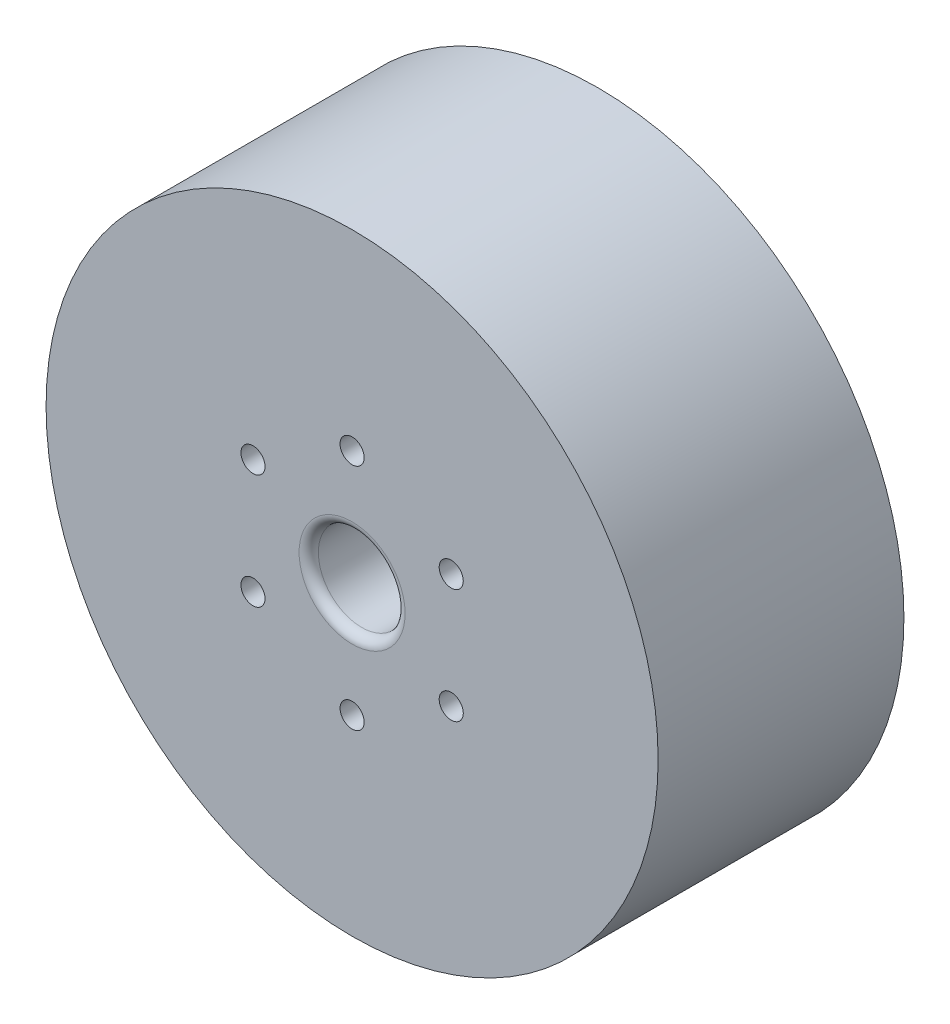
ISO-10303-21;
HEADER;
FILE_DESCRIPTION(('STEP AP214'),'2;1');
FILE_NAME('part.step','',(''),(''),'','','');
FILE_SCHEMA(('AUTOMOTIVE_DESIGN { 1 0 10303 214 1 1 1 1 }'));
ENDSEC;
DATA;
#1=APPLICATION_CONTEXT('core data for automotive mechanical design processes');
#2=APPLICATION_PROTOCOL_DEFINITION('international standard','automotive_design',2000,#1);
#3=PRODUCT_CONTEXT('',#1,'mechanical');
#4=PRODUCT('Part','Part','',(#3));
#5=PRODUCT_RELATED_PRODUCT_CATEGORY('part','',(#4));
#6=PRODUCT_DEFINITION_FORMATION('','',#4);
#7=PRODUCT_DEFINITION_CONTEXT('part definition',#1,'design');
#8=PRODUCT_DEFINITION('design','',#6,#7);
#9=PRODUCT_DEFINITION_SHAPE('','',#8);
#10=(LENGTH_UNIT() NAMED_UNIT(*) SI_UNIT(.MILLI.,.METRE.));
#11=(NAMED_UNIT(*) PLANE_ANGLE_UNIT() SI_UNIT($,.RADIAN.));
#12=(NAMED_UNIT(*) SI_UNIT($,.STERADIAN.) SOLID_ANGLE_UNIT());
#13=UNCERTAINTY_MEASURE_WITH_UNIT(LENGTH_MEASURE(1.E-05),#10,'distance_accuracy_value','');
#14=(GEOMETRIC_REPRESENTATION_CONTEXT(3) GLOBAL_UNCERTAINTY_ASSIGNED_CONTEXT((#13)) GLOBAL_UNIT_ASSIGNED_CONTEXT((#10,
#11,#12)) REPRESENTATION_CONTEXT('',''));
#15=CARTESIAN_POINT('',(0.,0.,0.));
#16=DIRECTION('',(0.,0.,1.));
#17=DIRECTION('',(1.,0.,0.));
#18=AXIS2_PLACEMENT_3D('',#15,#16,#17);
#19=CARTESIAN_POINT('',(0.,0.,25.5));
#20=DIRECTION('',(0.,0.,1.));
#21=DIRECTION('',(1.,0.,0.));
#22=AXIS2_PLACEMENT_3D('',#19,#20,#21);
#23=PLANE('',#22);
#24=CARTESIAN_POINT('',(0.,0.,25.5));
#25=DIRECTION('',(0.,0.,1.));
#26=DIRECTION('',(1.,0.,0.));
#27=AXIS2_PLACEMENT_3D('',#24,#25,#26);
#28=CIRCLE('',#27,11.);
#29=CARTESIAN_POINT('',(11.,0.,25.5));
#30=VERTEX_POINT('',#29);
#31=EDGE_CURVE('E10',#30,#30,#28,.F.);
#32=ORIENTED_EDGE('',*,*,#31,.T.);
#33=EDGE_LOOP('',(#32));
#34=FACE_BOUND('',#33,.T.);
#35=CARTESIAN_POINT('',(-20.5681033398769,-11.8750000000021,25.5));
#36=DIRECTION('',(0.,0.,1.));
#37=DIRECTION('',(1.,0.,0.));
#38=AXIS2_PLACEMENT_3D('',#35,#36,#37);
#39=CIRCLE('',#38,2.5000000000042);
#40=CARTESIAN_POINT('',(-18.0681033398727,-11.8750000000021,25.5));
#41=VERTEX_POINT('',#40);
#42=EDGE_CURVE('E104',#41,#41,#39,.T.);
#43=ORIENTED_EDGE('',*,*,#42,.F.);
#44=EDGE_LOOP('',(#43));
#45=FACE_BOUND('',#44,.T.);
#46=CARTESIAN_POINT('',(20.568103339884,-11.874999999998,25.5));
#47=DIRECTION('',(0.,0.,1.));
#48=DIRECTION('',(1.,0.,0.));
#49=AXIS2_PLACEMENT_3D('',#46,#47,#48);
#50=CIRCLE('',#49,2.50000000000289);
#51=CARTESIAN_POINT('',(23.0681033398869,-11.874999999998,25.5));
#52=VERTEX_POINT('',#51);
#53=EDGE_CURVE('E88',#52,#52,#50,.T.);
#54=ORIENTED_EDGE('',*,*,#53,.F.);
#55=EDGE_LOOP('',(#54));
#56=FACE_BOUND('',#55,.T.);
#57=CARTESIAN_POINT('',(0.,23.75,25.5));
#58=DIRECTION('',(0.,0.,1.));
#59=DIRECTION('',(1.,0.,0.));
#60=AXIS2_PLACEMENT_3D('',#57,#58,#59);
#61=CIRCLE('',#60,2.5);
#62=CARTESIAN_POINT('',(2.5,23.75,25.5));
#63=VERTEX_POINT('',#62);
#64=EDGE_CURVE('E72',#63,#63,#61,.T.);
#65=ORIENTED_EDGE('',*,*,#64,.F.);
#66=EDGE_LOOP('',(#65));
#67=FACE_BOUND('',#66,.T.);
#68=CARTESIAN_POINT('',(0.,0.,25.5));
#69=DIRECTION('',(0.,0.,1.));
#70=DIRECTION('',(1.,0.,0.));
#71=AXIS2_PLACEMENT_3D('',#68,#69,#70);
#72=CIRCLE('',#71,63.5);
#73=CARTESIAN_POINT('',(63.5,0.,25.5));
#74=VERTEX_POINT('',#73);
#75=EDGE_CURVE('E67',#74,#74,#72,.T.);
#76=ORIENTED_EDGE('',*,*,#75,.T.);
#77=EDGE_LOOP('',(#76));
#78=FACE_BOUND('',#77,.T.);
#79=CARTESIAN_POINT('',(20.5681033398816,11.875000000002,25.5));
#80=DIRECTION('',(0.,0.,1.));
#81=DIRECTION('',(1.,0.,0.));
#82=AXIS2_PLACEMENT_3D('',#79,#80,#81);
#83=CIRCLE('',#82,2.50000000000059);
#84=CARTESIAN_POINT('',(23.0681033398822,11.875000000002,25.5));
#85=VERTEX_POINT('',#84);
#86=EDGE_CURVE('E80',#85,#85,#83,.T.);
#87=ORIENTED_EDGE('',*,*,#86,.F.);
#88=EDGE_LOOP('',(#87));
#89=FACE_BOUND('',#88,.T.);
#90=CARTESIAN_POINT('',(4.71638358436074E-12,-23.75,25.5));
#91=DIRECTION('',(0.,0.,1.));
#92=DIRECTION('',(1.,0.,0.));
#93=AXIS2_PLACEMENT_3D('',#90,#91,#92);
#94=CIRCLE('',#93,2.50000000000467);
#95=CARTESIAN_POINT('',(2.50000000000938,-23.75,25.5));
#96=VERTEX_POINT('',#95);
#97=EDGE_CURVE('E96',#96,#96,#94,.T.);
#98=ORIENTED_EDGE('',*,*,#97,.F.);
#99=EDGE_LOOP('',(#98));
#100=FACE_BOUND('',#99,.T.);
#101=CARTESIAN_POINT('',(-20.5681033398793,11.8749999999979,25.5));
#102=DIRECTION('',(0.,0.,1.));
#103=DIRECTION('',(1.,0.,0.));
#104=AXIS2_PLACEMENT_3D('',#101,#102,#103);
#105=CIRCLE('',#104,2.50000000000201);
#106=CARTESIAN_POINT('',(-18.0681033398772,11.8749999999979,25.5));
#107=VERTEX_POINT('',#106);
#108=EDGE_CURVE('E112',#107,#107,#105,.T.);
#109=ORIENTED_EDGE('',*,*,#108,.F.);
#110=EDGE_LOOP('',(#109));
#111=FACE_BOUND('',#110,.T.);
#112=ADVANCED_FACE('F43',(#34,#45,#56,#67,#78,#89,#100,#111),#23,.T.);
#113=CARTESIAN_POINT('',(0.,0.,-25.5));
#114=DIRECTION('',(0.,0.,1.));
#115=DIRECTION('',(1.,0.,0.));
#116=AXIS2_PLACEMENT_3D('',#113,#114,#115);
#117=PLANE('',#116);
#118=CARTESIAN_POINT('',(0.,0.,-25.5));
#119=DIRECTION('',(0.,0.,1.));
#120=DIRECTION('',(1.,0.,0.));
#121=AXIS2_PLACEMENT_3D('',#118,#119,#120);
#122=CIRCLE('',#121,11.);
#123=CARTESIAN_POINT('',(11.,0.,-25.5));
#124=VERTEX_POINT('',#123);
#125=EDGE_CURVE('E61',#124,#124,#122,.T.);
#126=ORIENTED_EDGE('',*,*,#125,.T.);
#127=EDGE_LOOP('',(#126));
#128=FACE_BOUND('',#127,.T.);
#129=CARTESIAN_POINT('',(0.,0.,-25.5));
#130=DIRECTION('',(0.,0.,1.));
#131=DIRECTION('',(1.,0.,0.));
#132=AXIS2_PLACEMENT_3D('',#129,#130,#131);
#133=CIRCLE('',#132,63.5);
#134=CARTESIAN_POINT('',(63.5,0.,-25.5));
#135=VERTEX_POINT('',#134);
#136=EDGE_CURVE('E68',#135,#135,#133,.T.);
#137=ORIENTED_EDGE('',*,*,#136,.F.);
#138=EDGE_LOOP('',(#137));
#139=FACE_BOUND('',#138,.T.);
#140=CARTESIAN_POINT('',(0.,23.75,-25.5));
#141=DIRECTION('',(0.,0.,1.));
#142=DIRECTION('',(1.,0.,0.));
#143=AXIS2_PLACEMENT_3D('',#140,#141,#142);
#144=CIRCLE('',#143,2.5);
#145=CARTESIAN_POINT('',(2.5,23.75,-25.5));
#146=VERTEX_POINT('',#145);
#147=EDGE_CURVE('E76',#146,#146,#144,.T.);
#148=ORIENTED_EDGE('',*,*,#147,.T.);
#149=EDGE_LOOP('',(#148));
#150=FACE_BOUND('',#149,.T.);
#151=CARTESIAN_POINT('',(20.5681033398816,11.875000000002,-25.5));
#152=DIRECTION('',(0.,0.,1.));
#153=DIRECTION('',(1.,0.,0.));
#154=AXIS2_PLACEMENT_3D('',#151,#152,#153);
#155=CIRCLE('',#154,2.50000000000059);
#156=CARTESIAN_POINT('',(23.0681033398822,11.875000000002,-25.5));
#157=VERTEX_POINT('',#156);
#158=EDGE_CURVE('E84',#157,#157,#155,.T.);
#159=ORIENTED_EDGE('',*,*,#158,.T.);
#160=EDGE_LOOP('',(#159));
#161=FACE_BOUND('',#160,.T.);
#162=CARTESIAN_POINT('',(20.568103339884,-11.874999999998,-25.5));
#163=DIRECTION('',(0.,0.,1.));
#164=DIRECTION('',(1.,0.,0.));
#165=AXIS2_PLACEMENT_3D('',#162,#163,#164);
#166=CIRCLE('',#165,2.50000000000289);
#167=CARTESIAN_POINT('',(23.0681033398869,-11.874999999998,-25.5));
#168=VERTEX_POINT('',#167);
#169=EDGE_CURVE('E92',#168,#168,#166,.T.);
#170=ORIENTED_EDGE('',*,*,#169,.T.);
#171=EDGE_LOOP('',(#170));
#172=FACE_BOUND('',#171,.T.);
#173=CARTESIAN_POINT('',(4.71638358436074E-12,-23.75,-25.5));
#174=DIRECTION('',(0.,0.,1.));
#175=DIRECTION('',(1.,0.,0.));
#176=AXIS2_PLACEMENT_3D('',#173,#174,#175);
#177=CIRCLE('',#176,2.50000000000467);
#178=CARTESIAN_POINT('',(2.50000000000938,-23.75,-25.5));
#179=VERTEX_POINT('',#178);
#180=EDGE_CURVE('E100',#179,#179,#177,.T.);
#181=ORIENTED_EDGE('',*,*,#180,.T.);
#182=EDGE_LOOP('',(#181));
#183=FACE_BOUND('',#182,.T.);
#184=CARTESIAN_POINT('',(-20.5681033398769,-11.8750000000021,-25.5));
#185=DIRECTION('',(0.,0.,1.));
#186=DIRECTION('',(1.,0.,0.));
#187=AXIS2_PLACEMENT_3D('',#184,#185,#186);
#188=CIRCLE('',#187,2.5000000000042);
#189=CARTESIAN_POINT('',(-18.0681033398727,-11.8750000000021,-25.5));
#190=VERTEX_POINT('',#189);
#191=EDGE_CURVE('E108',#190,#190,#188,.T.);
#192=ORIENTED_EDGE('',*,*,#191,.T.);
#193=EDGE_LOOP('',(#192));
#194=FACE_BOUND('',#193,.T.);
#195=CARTESIAN_POINT('',(-20.5681033398793,11.8749999999979,-25.5));
#196=DIRECTION('',(0.,0.,1.));
#197=DIRECTION('',(1.,0.,0.));
#198=AXIS2_PLACEMENT_3D('',#195,#196,#197);
#199=CIRCLE('',#198,2.50000000000201);
#200=CARTESIAN_POINT('',(-18.0681033398772,11.8749999999979,-25.5));
#201=VERTEX_POINT('',#200);
#202=EDGE_CURVE('E116',#201,#201,#199,.T.);
#203=ORIENTED_EDGE('',*,*,#202,.T.);
#204=EDGE_LOOP('',(#203));
#205=FACE_BOUND('',#204,.T.);
#206=ADVANCED_FACE('F128',(#128,#139,#150,#161,#172,#183,#194,#205),#117,.F.);
#207=CARTESIAN_POINT('',(0.,0.,25.5));
#208=DIRECTION('',(0.,0.,-1.));
#209=DIRECTION('',(-1.,0.,0.));
#210=AXIS2_PLACEMENT_3D('',#207,#208,#209);
#211=CYLINDRICAL_SURFACE('',#210,63.5);
#212=ORIENTED_EDGE('',*,*,#75,.F.);
#213=EDGE_LOOP('',(#212));
#214=FACE_BOUND('',#213,.T.);
#215=ORIENTED_EDGE('',*,*,#136,.T.);
#216=EDGE_LOOP('',(#215));
#217=FACE_BOUND('',#216,.T.);
#218=ADVANCED_FACE('F134',(#214,#217),#211,.T.);
#219=CARTESIAN_POINT('',(0.,0.,25.5));
#220=DIRECTION('',(0.,0.,-1.));
#221=DIRECTION('',(-1.,0.,0.));
#222=AXIS2_PLACEMENT_3D('',#219,#220,#221);
#223=CYLINDRICAL_SURFACE('',#222,9.);
#224=CARTESIAN_POINT('',(0.,0.,-23.5));
#225=DIRECTION('',(0.,0.,1.));
#226=DIRECTION('',(1.,0.,0.));
#227=AXIS2_PLACEMENT_3D('',#224,#225,#226);
#228=CIRCLE('',#227,9.);
#229=CARTESIAN_POINT('',(9.,0.,-23.5));
#230=VERTEX_POINT('',#229);
#231=EDGE_CURVE('E51',#230,#230,#228,.F.);
#232=ORIENTED_EDGE('',*,*,#231,.T.);
#233=EDGE_LOOP('',(#232));
#234=FACE_BOUND('',#233,.T.);
#235=CARTESIAN_POINT('',(0.,0.,23.5));
#236=DIRECTION('',(0.,0.,1.));
#237=DIRECTION('',(1.,0.,0.));
#238=AXIS2_PLACEMENT_3D('',#235,#236,#237);
#239=CIRCLE('',#238,9.);
#240=CARTESIAN_POINT('',(9.,0.,23.5));
#241=VERTEX_POINT('',#240);
#242=EDGE_CURVE('E56',#241,#241,#239,.T.);
#243=ORIENTED_EDGE('',*,*,#242,.T.);
#244=EDGE_LOOP('',(#243));
#245=FACE_BOUND('',#244,.T.);
#246=ADVANCED_FACE('F139',(#234,#245),#223,.F.);
#247=CARTESIAN_POINT('',(0.,23.75,25.5));
#248=DIRECTION('',(0.,0.,-1.));
#249=DIRECTION('',(-1.,0.,0.));
#250=AXIS2_PLACEMENT_3D('',#247,#248,#249);
#251=CYLINDRICAL_SURFACE('',#250,2.5);
#252=ORIENTED_EDGE('',*,*,#64,.T.);
#253=EDGE_LOOP('',(#252));
#254=FACE_BOUND('',#253,.T.);
#255=ORIENTED_EDGE('',*,*,#147,.F.);
#256=EDGE_LOOP('',(#255));
#257=FACE_BOUND('',#256,.T.);
#258=ADVANCED_FACE('F187',(#254,#257),#251,.F.);
#259=CARTESIAN_POINT('',(20.5681033398816,11.875000000002,25.5));
#260=DIRECTION('',(0.,0.,-1.));
#261=DIRECTION('',(-1.,0.,0.));
#262=AXIS2_PLACEMENT_3D('',#259,#260,#261);
#263=CYLINDRICAL_SURFACE('',#262,2.50000000000059);
#264=ORIENTED_EDGE('',*,*,#86,.T.);
#265=EDGE_LOOP('',(#264));
#266=FACE_BOUND('',#265,.T.);
#267=ORIENTED_EDGE('',*,*,#158,.F.);
#268=EDGE_LOOP('',(#267));
#269=FACE_BOUND('',#268,.T.);
#270=ADVANCED_FACE('F184',(#266,#269),#263,.F.);
#271=CARTESIAN_POINT('',(20.568103339884,-11.874999999998,25.5));
#272=DIRECTION('',(0.,0.,-1.));
#273=DIRECTION('',(-1.,0.,0.));
#274=AXIS2_PLACEMENT_3D('',#271,#272,#273);
#275=CYLINDRICAL_SURFACE('',#274,2.50000000000289);
#276=ORIENTED_EDGE('',*,*,#53,.T.);
#277=EDGE_LOOP('',(#276));
#278=FACE_BOUND('',#277,.T.);
#279=ORIENTED_EDGE('',*,*,#169,.F.);
#280=EDGE_LOOP('',(#279));
#281=FACE_BOUND('',#280,.T.);
#282=ADVANCED_FACE('F178',(#278,#281),#275,.F.);
#283=CARTESIAN_POINT('',(4.71638358436074E-12,-23.75,25.5));
#284=DIRECTION('',(0.,0.,-1.));
#285=DIRECTION('',(-1.,0.,0.));
#286=AXIS2_PLACEMENT_3D('',#283,#284,#285);
#287=CYLINDRICAL_SURFACE('',#286,2.50000000000467);
#288=ORIENTED_EDGE('',*,*,#97,.T.);
#289=EDGE_LOOP('',(#288));
#290=FACE_BOUND('',#289,.T.);
#291=ORIENTED_EDGE('',*,*,#180,.F.);
#292=EDGE_LOOP('',(#291));
#293=FACE_BOUND('',#292,.T.);
#294=ADVANCED_FACE('F172',(#290,#293),#287,.F.);
#295=CARTESIAN_POINT('',(-20.5681033398769,-11.8750000000021,25.5));
#296=DIRECTION('',(0.,0.,-1.));
#297=DIRECTION('',(-1.,0.,0.));
#298=AXIS2_PLACEMENT_3D('',#295,#296,#297);
#299=CYLINDRICAL_SURFACE('',#298,2.5000000000042);
#300=ORIENTED_EDGE('',*,*,#42,.T.);
#301=EDGE_LOOP('',(#300));
#302=FACE_BOUND('',#301,.T.);
#303=ORIENTED_EDGE('',*,*,#191,.F.);
#304=EDGE_LOOP('',(#303));
#305=FACE_BOUND('',#304,.T.);
#306=ADVANCED_FACE('F152',(#302,#305),#299,.F.);
#307=CARTESIAN_POINT('',(-20.5681033398793,11.8749999999979,25.5));
#308=DIRECTION('',(0.,0.,-1.));
#309=DIRECTION('',(-1.,0.,0.));
#310=AXIS2_PLACEMENT_3D('',#307,#308,#309);
#311=CYLINDRICAL_SURFACE('',#310,2.50000000000201);
#312=ORIENTED_EDGE('',*,*,#108,.T.);
#313=EDGE_LOOP('',(#312));
#314=FACE_BOUND('',#313,.T.);
#315=ORIENTED_EDGE('',*,*,#202,.F.);
#316=EDGE_LOOP('',(#315));
#317=FACE_BOUND('',#316,.T.);
#318=ADVANCED_FACE('F124',(#314,#317),#311,.F.);
#319=CARTESIAN_POINT('',(0.,0.,-23.5));
#320=DIRECTION('',(0.,0.,1.));
#321=DIRECTION('',(1.,0.,0.));
#322=AXIS2_PLACEMENT_3D('',#319,#320,#321);
#323=TOROIDAL_SURFACE('',#322,11.,2.);
#324=ORIENTED_EDGE('',*,*,#231,.F.);
#325=EDGE_LOOP('',(#324));
#326=FACE_BOUND('',#325,.T.);
#327=ORIENTED_EDGE('',*,*,#125,.F.);
#328=EDGE_LOOP('',(#327));
#329=FACE_BOUND('',#328,.T.);
#330=ADVANCED_FACE('F144',(#326,#329),#323,.T.);
#331=CARTESIAN_POINT('',(0.,0.,23.5));
#332=DIRECTION('',(0.,0.,1.));
#333=DIRECTION('',(1.,0.,0.));
#334=AXIS2_PLACEMENT_3D('',#331,#332,#333);
#335=TOROIDAL_SURFACE('',#334,11.,2.);
#336=ORIENTED_EDGE('',*,*,#31,.F.);
#337=EDGE_LOOP('',(#336));
#338=FACE_BOUND('',#337,.T.);
#339=ORIENTED_EDGE('',*,*,#242,.F.);
#340=EDGE_LOOP('',(#339));
#341=FACE_BOUND('',#340,.T.);
#342=ADVANCED_FACE('F45',(#338,#341),#335,.T.);
#343=CLOSED_SHELL('',(#112,#206,#218,#246,#258,#270,#282,#294,#306,#318,#330,#342));
#344=MANIFOLD_SOLID_BREP('B2',#343);
#345=ADVANCED_BREP_SHAPE_REPRESENTATION('',(#18,#344),#14);
#346=SHAPE_DEFINITION_REPRESENTATION(#9,#345);
ENDSEC;
END-ISO-10303-21;
